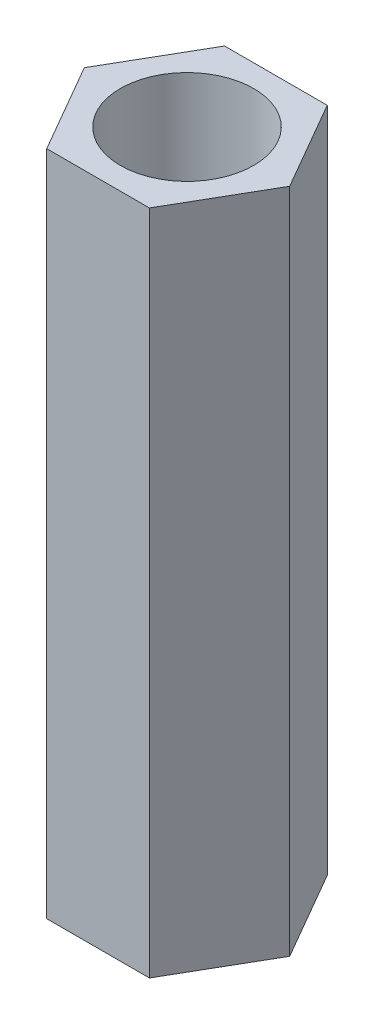
ISO-10303-21;
HEADER;
FILE_DESCRIPTION(('STEP AP214'),'2;1');
FILE_NAME('part.step','',(''),(''),'','','');
FILE_SCHEMA(('AUTOMOTIVE_DESIGN { 1 0 10303 214 1 1 1 1 }'));
ENDSEC;
DATA;
#1=APPLICATION_CONTEXT('core data for automotive mechanical design processes');
#2=APPLICATION_PROTOCOL_DEFINITION('international standard','automotive_design',2000,#1);
#3=PRODUCT_CONTEXT('',#1,'mechanical');
#4=PRODUCT('Part','Part','',(#3));
#5=PRODUCT_RELATED_PRODUCT_CATEGORY('part','',(#4));
#6=PRODUCT_DEFINITION_FORMATION('','',#4);
#7=PRODUCT_DEFINITION_CONTEXT('part definition',#1,'design');
#8=PRODUCT_DEFINITION('design','',#6,#7);
#9=PRODUCT_DEFINITION_SHAPE('','',#8);
#10=(LENGTH_UNIT() NAMED_UNIT(*) SI_UNIT(.MILLI.,.METRE.));
#11=(NAMED_UNIT(*) PLANE_ANGLE_UNIT() SI_UNIT($,.RADIAN.));
#12=(NAMED_UNIT(*) SI_UNIT($,.STERADIAN.) SOLID_ANGLE_UNIT());
#13=UNCERTAINTY_MEASURE_WITH_UNIT(LENGTH_MEASURE(1.E-05),#10,'distance_accuracy_value','');
#14=(GEOMETRIC_REPRESENTATION_CONTEXT(3) GLOBAL_UNCERTAINTY_ASSIGNED_CONTEXT((#13)) GLOBAL_UNIT_ASSIGNED_CONTEXT((#10,
#11,#12)) REPRESENTATION_CONTEXT('',''));
#15=CARTESIAN_POINT('',(0.,0.,0.));
#16=DIRECTION('',(0.,0.,1.));
#17=DIRECTION('',(1.,0.,0.));
#18=AXIS2_PLACEMENT_3D('',#15,#16,#17);
#19=CARTESIAN_POINT('',(1.15470053837925,15.,2.));
#20=DIRECTION('',(-0.866025403784439,0.,-0.5));
#21=DIRECTION('',(-0.5,0.,0.866025403784439));
#22=AXIS2_PLACEMENT_3D('',#19,#20,#21);
#23=PLANE('',#22);
#24=DIRECTION('',(0.5,0.,-0.866025403784439));
#25=VECTOR('',#24,1.);
#26=CARTESIAN_POINT('',(1.15470053837925,0.,2.));
#27=LINE('',#26,#25);
#28=CARTESIAN_POINT('',(1.15470053837925,0.,2.));
#29=VERTEX_POINT('',#28);
#30=CARTESIAN_POINT('',(2.3094010767585,0.,0.));
#31=VERTEX_POINT('',#30);
#32=EDGE_CURVE('E129',#29,#31,#27,.T.);
#33=ORIENTED_EDGE('',*,*,#32,.T.);
#34=DIRECTION('',(0.,-1.,0.));
#35=VECTOR('',#34,1.);
#36=CARTESIAN_POINT('',(2.3094010767585,15.,0.));
#37=LINE('',#36,#35);
#38=CARTESIAN_POINT('',(2.3094010767585,15.,0.));
#39=VERTEX_POINT('',#38);
#40=EDGE_CURVE('E11',#39,#31,#37,.T.);
#41=ORIENTED_EDGE('',*,*,#40,.F.);
#42=DIRECTION('',(0.5,0.,-0.866025403784439));
#43=VECTOR('',#42,1.);
#44=CARTESIAN_POINT('',(1.15470053837925,15.,2.));
#45=LINE('',#44,#43);
#46=CARTESIAN_POINT('',(1.15470053837925,15.,2.));
#47=VERTEX_POINT('',#46);
#48=EDGE_CURVE('E140',#47,#39,#45,.T.);
#49=ORIENTED_EDGE('',*,*,#48,.F.);
#50=DIRECTION('',(0.,-1.,0.));
#51=VECTOR('',#50,1.);
#52=CARTESIAN_POINT('',(1.15470053837925,15.,2.));
#53=LINE('',#52,#51);
#54=EDGE_CURVE('E125',#47,#29,#53,.T.);
#55=ORIENTED_EDGE('',*,*,#54,.T.);
#56=EDGE_LOOP('',(#33,#41,#49,#55));
#57=FACE_BOUND('',#56,.T.);
#58=ADVANCED_FACE('F45',(#57),#23,.F.);
#59=CARTESIAN_POINT('',(2.3094010767585,15.,0.));
#60=DIRECTION('',(-0.866025403784438,0.,0.5));
#61=DIRECTION('',(0.5,0.,0.866025403784439));
#62=AXIS2_PLACEMENT_3D('',#59,#60,#61);
#63=PLANE('',#62);
#64=DIRECTION('',(-0.5,0.,-0.866025403784438));
#65=VECTOR('',#64,1.);
#66=CARTESIAN_POINT('',(2.3094010767585,0.,0.));
#67=LINE('',#66,#65);
#68=CARTESIAN_POINT('',(1.15470053837925,0.,-2.));
#69=VERTEX_POINT('',#68);
#70=EDGE_CURVE('E132',#31,#69,#67,.T.);
#71=ORIENTED_EDGE('',*,*,#70,.T.);
#72=DIRECTION('',(0.,-1.,0.));
#73=VECTOR('',#72,1.);
#74=CARTESIAN_POINT('',(1.15470053837925,15.,-2.));
#75=LINE('',#74,#73);
#76=CARTESIAN_POINT('',(1.15470053837925,15.,-2.));
#77=VERTEX_POINT('',#76);
#78=EDGE_CURVE('E53',#77,#69,#75,.T.);
#79=ORIENTED_EDGE('',*,*,#78,.F.);
#80=DIRECTION('',(-0.5,0.,-0.866025403784438));
#81=VECTOR('',#80,1.);
#82=CARTESIAN_POINT('',(2.3094010767585,15.,0.));
#83=LINE('',#82,#81);
#84=EDGE_CURVE('E98',#39,#77,#83,.T.);
#85=ORIENTED_EDGE('',*,*,#84,.F.);
#86=ORIENTED_EDGE('',*,*,#40,.T.);
#87=EDGE_LOOP('',(#71,#79,#85,#86));
#88=FACE_BOUND('',#87,.T.);
#89=ADVANCED_FACE('F165',(#88),#63,.F.);
#90=CARTESIAN_POINT('',(1.15470053837925,15.,-2.));
#91=DIRECTION('',(0.,0.,1.));
#92=DIRECTION('',(1.,0.,0.));
#93=AXIS2_PLACEMENT_3D('',#90,#91,#92);
#94=PLANE('',#93);
#95=DIRECTION('',(-1.,0.,0.));
#96=VECTOR('',#95,1.);
#97=CARTESIAN_POINT('',(1.15470053837925,0.,-2.));
#98=LINE('',#97,#96);
#99=CARTESIAN_POINT('',(-1.15470053837925,0.,-2.));
#100=VERTEX_POINT('',#99);
#101=EDGE_CURVE('E135',#69,#100,#98,.T.);
#102=ORIENTED_EDGE('',*,*,#101,.T.);
#103=DIRECTION('',(0.,-1.,0.));
#104=VECTOR('',#103,1.);
#105=CARTESIAN_POINT('',(-1.15470053837925,15.,-2.));
#106=LINE('',#105,#104);
#107=CARTESIAN_POINT('',(-1.15470053837925,15.,-2.));
#108=VERTEX_POINT('',#107);
#109=EDGE_CURVE('E120',#108,#100,#106,.T.);
#110=ORIENTED_EDGE('',*,*,#109,.F.);
#111=DIRECTION('',(-1.,0.,0.));
#112=VECTOR('',#111,1.);
#113=CARTESIAN_POINT('',(1.15470053837925,15.,-2.));
#114=LINE('',#113,#112);
#115=EDGE_CURVE('E111',#77,#108,#114,.T.);
#116=ORIENTED_EDGE('',*,*,#115,.F.);
#117=ORIENTED_EDGE('',*,*,#78,.T.);
#118=EDGE_LOOP('',(#102,#110,#116,#117));
#119=FACE_BOUND('',#118,.T.);
#120=ADVANCED_FACE('F146',(#119),#94,.F.);
#121=CARTESIAN_POINT('',(-1.15470053837925,15.,-2.));
#122=DIRECTION('',(0.866025403784439,0.,0.5));
#123=DIRECTION('',(0.5,0.,-0.866025403784439));
#124=AXIS2_PLACEMENT_3D('',#121,#122,#123);
#125=PLANE('',#124);
#126=DIRECTION('',(-0.5,0.,0.866025403784439));
#127=VECTOR('',#126,1.);
#128=CARTESIAN_POINT('',(-1.15470053837925,0.,-2.));
#129=LINE('',#128,#127);
#130=CARTESIAN_POINT('',(-2.3094010767585,0.,0.));
#131=VERTEX_POINT('',#130);
#132=EDGE_CURVE('E119',#100,#131,#129,.T.);
#133=ORIENTED_EDGE('',*,*,#132,.T.);
#134=DIRECTION('',(0.,-1.,0.));
#135=VECTOR('',#134,1.);
#136=CARTESIAN_POINT('',(-2.3094010767585,15.,0.));
#137=LINE('',#136,#135);
#138=CARTESIAN_POINT('',(-2.3094010767585,15.,0.));
#139=VERTEX_POINT('',#138);
#140=EDGE_CURVE('E116',#139,#131,#137,.T.);
#141=ORIENTED_EDGE('',*,*,#140,.F.);
#142=DIRECTION('',(-0.5,0.,0.866025403784439));
#143=VECTOR('',#142,1.);
#144=CARTESIAN_POINT('',(-1.15470053837925,15.,-2.));
#145=LINE('',#144,#143);
#146=EDGE_CURVE('E105',#108,#139,#145,.T.);
#147=ORIENTED_EDGE('',*,*,#146,.F.);
#148=ORIENTED_EDGE('',*,*,#109,.T.);
#149=EDGE_LOOP('',(#133,#141,#147,#148));
#150=FACE_BOUND('',#149,.T.);
#151=ADVANCED_FACE('F117',(#150),#125,.F.);
#152=CARTESIAN_POINT('',(-2.3094010767585,15.,0.));
#153=DIRECTION('',(0.866025403784439,0.,-0.5));
#154=DIRECTION('',(-0.5,0.,-0.866025403784439));
#155=AXIS2_PLACEMENT_3D('',#152,#153,#154);
#156=PLANE('',#155);
#157=DIRECTION('',(0.5,0.,0.866025403784439));
#158=VECTOR('',#157,1.);
#159=CARTESIAN_POINT('',(-2.3094010767585,0.,0.));
#160=LINE('',#159,#158);
#161=CARTESIAN_POINT('',(-1.15470053837925,0.,2.));
#162=VERTEX_POINT('',#161);
#163=EDGE_CURVE('E84',#131,#162,#160,.T.);
#164=ORIENTED_EDGE('',*,*,#163,.T.);
#165=DIRECTION('',(0.,-1.,0.));
#166=VECTOR('',#165,1.);
#167=CARTESIAN_POINT('',(-1.15470053837925,15.,2.));
#168=LINE('',#167,#166);
#169=CARTESIAN_POINT('',(-1.15470053837925,15.,2.));
#170=VERTEX_POINT('',#169);
#171=EDGE_CURVE('E121',#170,#162,#168,.T.);
#172=ORIENTED_EDGE('',*,*,#171,.F.);
#173=DIRECTION('',(0.5,0.,0.866025403784439));
#174=VECTOR('',#173,1.);
#175=CARTESIAN_POINT('',(-2.3094010767585,15.,0.));
#176=LINE('',#175,#174);
#177=EDGE_CURVE('E109',#139,#170,#176,.T.);
#178=ORIENTED_EDGE('',*,*,#177,.F.);
#179=ORIENTED_EDGE('',*,*,#140,.T.);
#180=EDGE_LOOP('',(#164,#172,#178,#179));
#181=FACE_BOUND('',#180,.T.);
#182=ADVANCED_FACE('F123',(#181),#156,.F.);
#183=CARTESIAN_POINT('',(-1.15470053837925,15.,2.));
#184=DIRECTION('',(0.,0.,-1.));
#185=DIRECTION('',(-1.,0.,0.));
#186=AXIS2_PLACEMENT_3D('',#183,#184,#185);
#187=PLANE('',#186);
#188=DIRECTION('',(1.,0.,0.));
#189=VECTOR('',#188,1.);
#190=CARTESIAN_POINT('',(-1.15470053837925,0.,2.));
#191=LINE('',#190,#189);
#192=EDGE_CURVE('E90',#162,#29,#191,.T.);
#193=ORIENTED_EDGE('',*,*,#192,.T.);
#194=ORIENTED_EDGE('',*,*,#54,.F.);
#195=DIRECTION('',(1.,0.,0.));
#196=VECTOR('',#195,1.);
#197=CARTESIAN_POINT('',(-1.15470053837925,15.,2.));
#198=LINE('',#197,#196);
#199=EDGE_CURVE('E61',#170,#47,#198,.T.);
#200=ORIENTED_EDGE('',*,*,#199,.F.);
#201=ORIENTED_EDGE('',*,*,#171,.T.);
#202=EDGE_LOOP('',(#193,#194,#200,#201));
#203=FACE_BOUND('',#202,.T.);
#204=ADVANCED_FACE('F153',(#203),#187,.F.);
#205=CARTESIAN_POINT('',(0.,15.,0.));
#206=DIRECTION('',(0.,1.,0.));
#207=DIRECTION('',(0.,0.,1.));
#208=AXIS2_PLACEMENT_3D('',#205,#206,#207);
#209=PLANE('',#208);
#210=CARTESIAN_POINT('',(0.,15.,0.));
#211=DIRECTION('',(0.,1.,0.));
#212=DIRECTION('',(0.,0.,1.));
#213=AXIS2_PLACEMENT_3D('',#210,#211,#212);
#214=CIRCLE('',#213,1.5);
#215=CARTESIAN_POINT('',(0.,15.,1.5));
#216=VERTEX_POINT('',#215);
#217=EDGE_CURVE('E239',#216,#216,#214,.T.);
#218=ORIENTED_EDGE('',*,*,#217,.F.);
#219=EDGE_LOOP('',(#218));
#220=FACE_BOUND('',#219,.T.);
#221=ORIENTED_EDGE('',*,*,#48,.T.);
#222=ORIENTED_EDGE('',*,*,#84,.T.);
#223=ORIENTED_EDGE('',*,*,#115,.T.);
#224=ORIENTED_EDGE('',*,*,#146,.T.);
#225=ORIENTED_EDGE('',*,*,#177,.T.);
#226=ORIENTED_EDGE('',*,*,#199,.T.);
#227=EDGE_LOOP('',(#221,#222,#223,#224,#225,#226));
#228=FACE_BOUND('',#227,.T.);
#229=ADVANCED_FACE('F107',(#220,#228),#209,.T.);
#230=CARTESIAN_POINT('',(0.,0.,0.));
#231=DIRECTION('',(0.,1.,0.));
#232=DIRECTION('',(0.,0.,1.));
#233=AXIS2_PLACEMENT_3D('',#230,#231,#232);
#234=PLANE('',#233);
#235=CARTESIAN_POINT('',(0.,0.,0.));
#236=DIRECTION('',(0.,1.,0.));
#237=DIRECTION('',(0.,0.,1.));
#238=AXIS2_PLACEMENT_3D('',#235,#236,#237);
#239=CIRCLE('',#238,1.5);
#240=CARTESIAN_POINT('',(0.,0.,1.5));
#241=VERTEX_POINT('',#240);
#242=EDGE_CURVE('E133',#241,#241,#239,.T.);
#243=ORIENTED_EDGE('',*,*,#242,.T.);
#244=EDGE_LOOP('',(#243));
#245=FACE_BOUND('',#244,.T.);
#246=ORIENTED_EDGE('',*,*,#32,.F.);
#247=ORIENTED_EDGE('',*,*,#192,.F.);
#248=ORIENTED_EDGE('',*,*,#163,.F.);
#249=ORIENTED_EDGE('',*,*,#132,.F.);
#250=ORIENTED_EDGE('',*,*,#101,.F.);
#251=ORIENTED_EDGE('',*,*,#70,.F.);
#252=EDGE_LOOP('',(#246,#247,#248,#249,#250,#251));
#253=FACE_BOUND('',#252,.T.);
#254=ADVANCED_FACE('F149',(#245,#253),#234,.F.);
#255=CARTESIAN_POINT('',(0.,0.,0.));
#256=DIRECTION('',(0.,1.,0.));
#257=DIRECTION('',(0.,0.,1.));
#258=AXIS2_PLACEMENT_3D('',#255,#256,#257);
#259=CYLINDRICAL_SURFACE('',#258,1.5);
#260=ORIENTED_EDGE('',*,*,#242,.F.);
#261=EDGE_LOOP('',(#260));
#262=FACE_BOUND('',#261,.T.);
#263=ORIENTED_EDGE('',*,*,#217,.T.);
#264=EDGE_LOOP('',(#263));
#265=FACE_BOUND('',#264,.T.);
#266=ADVANCED_FACE('F204',(#262,#265),#259,.F.);
#267=CLOSED_SHELL('',(#58,#89,#120,#151,#182,#204,#229,#254,#266));
#268=MANIFOLD_SOLID_BREP('B2',#267);
#269=ADVANCED_BREP_SHAPE_REPRESENTATION('',(#18,#268),#14);
#270=SHAPE_DEFINITION_REPRESENTATION(#9,#269);
ENDSEC;
END-ISO-10303-21;
